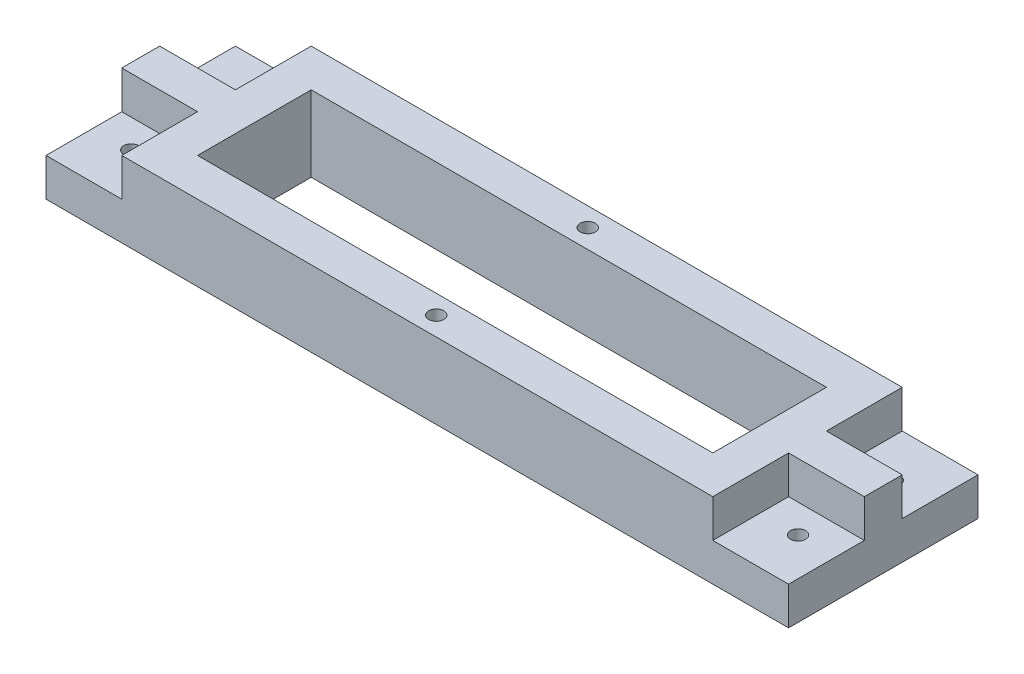
ISO-10303-21;
HEADER;
FILE_DESCRIPTION(('STEP AP214'),'2;1');
FILE_NAME('part.step','',(''),(''),'','','');
FILE_SCHEMA(('AUTOMOTIVE_DESIGN { 1 0 10303 214 1 1 1 1 }'));
ENDSEC;
DATA;
#1=APPLICATION_CONTEXT('core data for automotive mechanical design processes');
#2=APPLICATION_PROTOCOL_DEFINITION('international standard','automotive_design',2000,#1);
#3=PRODUCT_CONTEXT('',#1,'mechanical');
#4=PRODUCT('Part','Part','',(#3));
#5=PRODUCT_RELATED_PRODUCT_CATEGORY('part','',(#4));
#6=PRODUCT_DEFINITION_FORMATION('','',#4);
#7=PRODUCT_DEFINITION_CONTEXT('part definition',#1,'design');
#8=PRODUCT_DEFINITION('design','',#6,#7);
#9=PRODUCT_DEFINITION_SHAPE('','',#8);
#10=(LENGTH_UNIT() NAMED_UNIT(*) SI_UNIT(.MILLI.,.METRE.));
#11=(NAMED_UNIT(*) PLANE_ANGLE_UNIT() SI_UNIT($,.RADIAN.));
#12=(NAMED_UNIT(*) SI_UNIT($,.STERADIAN.) SOLID_ANGLE_UNIT());
#13=UNCERTAINTY_MEASURE_WITH_UNIT(LENGTH_MEASURE(1.E-05),#10,'distance_accuracy_value','');
#14=(GEOMETRIC_REPRESENTATION_CONTEXT(3) GLOBAL_UNCERTAINTY_ASSIGNED_CONTEXT((#13)) GLOBAL_UNIT_ASSIGNED_CONTEXT((#10,
#11,#12)) REPRESENTATION_CONTEXT('',''));
#15=CARTESIAN_POINT('',(0.,0.,0.));
#16=DIRECTION('',(0.,0.,1.));
#17=DIRECTION('',(1.,0.,0.));
#18=AXIS2_PLACEMENT_3D('',#15,#16,#17);
#19=CARTESIAN_POINT('',(0.,15.,-10.));
#20=DIRECTION('',(0.,-1.,0.));
#21=DIRECTION('',(0.,0.,-1.));
#22=AXIS2_PLACEMENT_3D('',#19,#20,#21);
#23=CYLINDRICAL_SURFACE('',#22,1.);
#24=CARTESIAN_POINT('',(0.,10.,-10.));
#25=DIRECTION('',(0.,1.,0.));
#26=DIRECTION('',(0.,0.,1.));
#27=AXIS2_PLACEMENT_3D('',#24,#25,#26);
#28=CIRCLE('',#27,1.);
#29=CARTESIAN_POINT('',(0.,10.,-9.00000000000001));
#30=VERTEX_POINT('',#29);
#31=EDGE_CURVE('E243',#30,#30,#28,.T.);
#32=ORIENTED_EDGE('',*,*,#31,.T.);
#33=EDGE_LOOP('',(#32));
#34=FACE_BOUND('',#33,.T.);
#35=CARTESIAN_POINT('',(0.,1.5,-10.));
#36=DIRECTION('',(0.,-1.,0.));
#37=DIRECTION('',(0.,0.,-1.));
#38=AXIS2_PLACEMENT_3D('',#35,#36,#37);
#39=CIRCLE('',#38,1.);
#40=CARTESIAN_POINT('',(0.,1.5,-11.));
#41=VERTEX_POINT('',#40);
#42=EDGE_CURVE('E40',#41,#41,#39,.F.);
#43=ORIENTED_EDGE('',*,*,#42,.F.);
#44=EDGE_LOOP('',(#43));
#45=FACE_BOUND('',#44,.T.);
#46=ADVANCED_FACE('F36',(#34,#45),#23,.F.);
#47=CARTESIAN_POINT('',(0.,0.,0.));
#48=DIRECTION('',(0.,1.,0.));
#49=DIRECTION('',(0.,0.,1.));
#50=AXIS2_PLACEMENT_3D('',#47,#48,#49);
#51=PLANE('',#50);
#52=CARTESIAN_POINT('',(0.,0.,-10.));
#53=DIRECTION('',(0.,-1.,0.));
#54=DIRECTION('',(0.,0.,-1.));
#55=AXIS2_PLACEMENT_3D('',#52,#53,#54);
#56=CIRCLE('',#55,1.75);
#57=CARTESIAN_POINT('',(0.,0.,-11.75));
#58=VERTEX_POINT('',#57);
#59=EDGE_CURVE('E254',#58,#58,#56,.T.);
#60=ORIENTED_EDGE('',*,*,#59,.F.);
#61=EDGE_LOOP('',(#60));
#62=FACE_BOUND('',#61,.T.);
#63=CARTESIAN_POINT('',(0.,0.,10.));
#64=DIRECTION('',(0.,-1.,0.));
#65=DIRECTION('',(0.,0.,-1.));
#66=AXIS2_PLACEMENT_3D('',#63,#64,#65);
#67=CIRCLE('',#66,1.75);
#68=CARTESIAN_POINT('',(0.,0.,8.25));
#69=VERTEX_POINT('',#68);
#70=EDGE_CURVE('E241',#69,#69,#67,.T.);
#71=ORIENTED_EDGE('',*,*,#70,.F.);
#72=EDGE_LOOP('',(#71));
#73=FACE_BOUND('',#72,.T.);
#74=CARTESIAN_POINT('',(44.,0.,-6.25));
#75=DIRECTION('',(0.,-1.,0.));
#76=DIRECTION('',(0.,0.,-1.));
#77=AXIS2_PLACEMENT_3D('',#74,#75,#76);
#78=CIRCLE('',#77,1.75);
#79=CARTESIAN_POINT('',(44.,0.,-8.00000000000001));
#80=VERTEX_POINT('',#79);
#81=EDGE_CURVE('E238',#80,#80,#78,.T.);
#82=ORIENTED_EDGE('',*,*,#81,.F.);
#83=EDGE_LOOP('',(#82));
#84=FACE_BOUND('',#83,.T.);
#85=CARTESIAN_POINT('',(-44.,0.,6.25));
#86=DIRECTION('',(0.,-1.,0.));
#87=DIRECTION('',(0.,0.,-1.));
#88=AXIS2_PLACEMENT_3D('',#85,#86,#87);
#89=CIRCLE('',#88,1.75);
#90=CARTESIAN_POINT('',(-44.,0.,4.5));
#91=VERTEX_POINT('',#90);
#92=EDGE_CURVE('E286',#91,#91,#89,.T.);
#93=ORIENTED_EDGE('',*,*,#92,.F.);
#94=EDGE_LOOP('',(#93));
#95=FACE_BOUND('',#94,.T.);
#96=DIRECTION('',(-1.,0.,0.));
#97=VECTOR('',#96,1.);
#98=CARTESIAN_POINT('',(-39.,0.,-12.5));
#99=LINE('',#98,#97);
#100=CARTESIAN_POINT('',(49.,0.,-12.5));
#101=VERTEX_POINT('',#100);
#102=CARTESIAN_POINT('',(-49.,0.,-12.5));
#103=VERTEX_POINT('',#102);
#104=EDGE_CURVE('E214',#101,#103,#99,.T.);
#105=ORIENTED_EDGE('',*,*,#104,.F.);
#106=DIRECTION('',(0.,0.,-1.));
#107=VECTOR('',#106,1.);
#108=CARTESIAN_POINT('',(49.,0.,12.5));
#109=LINE('',#108,#107);
#110=CARTESIAN_POINT('',(49.,0.,12.5));
#111=VERTEX_POINT('',#110);
#112=EDGE_CURVE('E331',#111,#101,#109,.T.);
#113=ORIENTED_EDGE('',*,*,#112,.F.);
#114=DIRECTION('',(1.,0.,0.));
#115=VECTOR('',#114,1.);
#116=CARTESIAN_POINT('',(-39.,0.,12.5));
#117=LINE('',#116,#115);
#118=CARTESIAN_POINT('',(-49.,0.,12.5));
#119=VERTEX_POINT('',#118);
#120=EDGE_CURVE('E216',#119,#111,#117,.T.);
#121=ORIENTED_EDGE('',*,*,#120,.F.);
#122=DIRECTION('',(0.,0.,1.));
#123=VECTOR('',#122,1.);
#124=CARTESIAN_POINT('',(-49.,0.,12.5));
#125=LINE('',#124,#123);
#126=EDGE_CURVE('E350',#103,#119,#125,.T.);
#127=ORIENTED_EDGE('',*,*,#126,.F.);
#128=EDGE_LOOP('',(#105,#113,#121,#127));
#129=FACE_BOUND('',#128,.T.);
#130=DIRECTION('',(0.,0.,-1.));
#131=VECTOR('',#130,1.);
#132=CARTESIAN_POINT('',(-34.,0.,0.));
#133=LINE('',#132,#131);
#134=CARTESIAN_POINT('',(-34.,0.,7.50000000000001));
#135=VERTEX_POINT('',#134);
#136=CARTESIAN_POINT('',(-34.,0.,-7.50000000000001));
#137=VERTEX_POINT('',#136);
#138=EDGE_CURVE('E371',#135,#137,#133,.T.);
#139=ORIENTED_EDGE('',*,*,#138,.F.);
#140=DIRECTION('',(-1.,0.,0.));
#141=VECTOR('',#140,1.);
#142=CARTESIAN_POINT('',(0.,0.,7.50000000000001));
#143=LINE('',#142,#141);
#144=CARTESIAN_POINT('',(34.,0.,7.50000000000001));
#145=VERTEX_POINT('',#144);
#146=EDGE_CURVE('E373',#145,#135,#143,.T.);
#147=ORIENTED_EDGE('',*,*,#146,.F.);
#148=DIRECTION('',(0.,0.,-1.));
#149=VECTOR('',#148,1.);
#150=CARTESIAN_POINT('',(34.,0.,0.));
#151=LINE('',#150,#149);
#152=CARTESIAN_POINT('',(34.,0.,-7.50000000000001));
#153=VERTEX_POINT('',#152);
#154=EDGE_CURVE('E376',#145,#153,#151,.T.);
#155=ORIENTED_EDGE('',*,*,#154,.T.);
#156=DIRECTION('',(-1.,0.,0.));
#157=VECTOR('',#156,1.);
#158=CARTESIAN_POINT('',(0.,0.,-7.50000000000001));
#159=LINE('',#158,#157);
#160=EDGE_CURVE('E379',#153,#137,#159,.T.);
#161=ORIENTED_EDGE('',*,*,#160,.T.);
#162=EDGE_LOOP('',(#139,#147,#155,#161));
#163=FACE_BOUND('',#162,.T.);
#164=CARTESIAN_POINT('',(44.,0.,6.25));
#165=DIRECTION('',(0.,-1.,0.));
#166=DIRECTION('',(0.,0.,-1.));
#167=AXIS2_PLACEMENT_3D('',#164,#165,#166);
#168=CIRCLE('',#167,1.75);
#169=CARTESIAN_POINT('',(44.,0.,4.5));
#170=VERTEX_POINT('',#169);
#171=EDGE_CURVE('E280',#170,#170,#168,.F.);
#172=ORIENTED_EDGE('',*,*,#171,.T.);
#173=EDGE_LOOP('',(#172));
#174=FACE_BOUND('',#173,.T.);
#175=CARTESIAN_POINT('',(-44.,0.,-6.25));
#176=DIRECTION('',(0.,-1.,0.));
#177=DIRECTION('',(0.,0.,-1.));
#178=AXIS2_PLACEMENT_3D('',#175,#176,#177);
#179=CIRCLE('',#178,1.75);
#180=CARTESIAN_POINT('',(-44.,0.,-8.00000000000001));
#181=VERTEX_POINT('',#180);
#182=EDGE_CURVE('E287',#181,#181,#179,.F.);
#183=ORIENTED_EDGE('',*,*,#182,.T.);
#184=EDGE_LOOP('',(#183));
#185=FACE_BOUND('',#184,.T.);
#186=ADVANCED_FACE('F425',(#62,#73,#84,#95,#129,#163,#174,#185),#51,.F.);
#187=CARTESIAN_POINT('',(-39.,10.,-12.5));
#188=DIRECTION('',(1.,0.,0.));
#189=DIRECTION('',(0.,0.,-1.));
#190=AXIS2_PLACEMENT_3D('',#187,#188,#189);
#191=PLANE('',#190);
#192=DIRECTION('',(0.,-1.,0.));
#193=VECTOR('',#192,1.);
#194=CARTESIAN_POINT('',(-39.,10.,2.5));
#195=LINE('',#194,#193);
#196=CARTESIAN_POINT('',(-39.,10.,2.5));
#197=VERTEX_POINT('',#196);
#198=CARTESIAN_POINT('',(-39.,5.,2.5));
#199=VERTEX_POINT('',#198);
#200=EDGE_CURVE('E190',#197,#199,#195,.T.);
#201=ORIENTED_EDGE('',*,*,#200,.T.);
#202=DIRECTION('',(0.,0.,-1.));
#203=VECTOR('',#202,1.);
#204=CARTESIAN_POINT('',(-39.,5.,-12.5));
#205=LINE('',#204,#203);
#206=CARTESIAN_POINT('',(-39.,5.,12.5));
#207=VERTEX_POINT('',#206);
#208=EDGE_CURVE('E354',#207,#199,#205,.T.);
#209=ORIENTED_EDGE('',*,*,#208,.F.);
#210=DIRECTION('',(0.,-1.,0.));
#211=VECTOR('',#210,1.);
#212=CARTESIAN_POINT('',(-39.,10.,12.5));
#213=LINE('',#212,#211);
#214=CARTESIAN_POINT('',(-39.,10.,12.5));
#215=VERTEX_POINT('',#214);
#216=EDGE_CURVE('E201',#215,#207,#213,.T.);
#217=ORIENTED_EDGE('',*,*,#216,.F.);
#218=DIRECTION('',(0.,0.,1.));
#219=VECTOR('',#218,1.);
#220=CARTESIAN_POINT('',(-39.,10.,-12.5));
#221=LINE('',#220,#219);
#222=EDGE_CURVE('E180',#197,#215,#221,.T.);
#223=ORIENTED_EDGE('',*,*,#222,.F.);
#224=EDGE_LOOP('',(#201,#209,#217,#223));
#225=FACE_BOUND('',#224,.T.);
#226=ADVANCED_FACE('F199',(#225),#191,.F.);
#227=CARTESIAN_POINT('',(-49.,5.,-12.5));
#228=DIRECTION('',(0.,-1.,0.));
#229=DIRECTION('',(0.,0.,-1.));
#230=AXIS2_PLACEMENT_3D('',#227,#228,#229);
#231=PLANE('',#230);
#232=CARTESIAN_POINT('',(-44.,5.,6.25));
#233=DIRECTION('',(0.,-1.,0.));
#234=DIRECTION('',(0.,0.,-1.));
#235=AXIS2_PLACEMENT_3D('',#232,#233,#234);
#236=CIRCLE('',#235,0.999999999999998);
#237=CARTESIAN_POINT('',(-44.,5.,5.25));
#238=VERTEX_POINT('',#237);
#239=EDGE_CURVE('E235',#238,#238,#236,.T.);
#240=ORIENTED_EDGE('',*,*,#239,.T.);
#241=EDGE_LOOP('',(#240));
#242=FACE_BOUND('',#241,.T.);
#243=DIRECTION('',(1.,0.,0.));
#244=VECTOR('',#243,1.);
#245=CARTESIAN_POINT('',(0.,5.,2.49999999999999));
#246=LINE('',#245,#244);
#247=CARTESIAN_POINT('',(-49.,5.,2.5));
#248=VERTEX_POINT('',#247);
#249=EDGE_CURVE('E193',#248,#199,#246,.T.);
#250=ORIENTED_EDGE('',*,*,#249,.F.);
#251=DIRECTION('',(0.,0.,-1.));
#252=VECTOR('',#251,1.);
#253=CARTESIAN_POINT('',(-49.,5.,-12.5));
#254=LINE('',#253,#252);
#255=CARTESIAN_POINT('',(-49.,5.,12.5));
#256=VERTEX_POINT('',#255);
#257=EDGE_CURVE('E357',#256,#248,#254,.T.);
#258=ORIENTED_EDGE('',*,*,#257,.F.);
#259=DIRECTION('',(1.,0.,0.));
#260=VECTOR('',#259,1.);
#261=CARTESIAN_POINT('',(-49.,5.,12.5));
#262=LINE('',#261,#260);
#263=EDGE_CURVE('E367',#256,#207,#262,.T.);
#264=ORIENTED_EDGE('',*,*,#263,.T.);
#265=ORIENTED_EDGE('',*,*,#208,.T.);
#266=EDGE_LOOP('',(#250,#258,#264,#265));
#267=FACE_BOUND('',#266,.T.);
#268=ADVANCED_FACE('F443',(#242,#267),#231,.F.);
#269=CARTESIAN_POINT('',(39.,10.,-12.5));
#270=DIRECTION('',(-1.,0.,0.));
#271=DIRECTION('',(0.,0.,1.));
#272=AXIS2_PLACEMENT_3D('',#269,#270,#271);
#273=PLANE('',#272);
#274=DIRECTION('',(0.,-1.,0.));
#275=VECTOR('',#274,1.);
#276=CARTESIAN_POINT('',(39.,10.,-2.50000000000003));
#277=LINE('',#276,#275);
#278=CARTESIAN_POINT('',(39.,10.,-2.50000000000003));
#279=VERTEX_POINT('',#278);
#280=CARTESIAN_POINT('',(39.,5.,-2.50000000000003));
#281=VERTEX_POINT('',#280);
#282=EDGE_CURVE('E322',#279,#281,#277,.T.);
#283=ORIENTED_EDGE('',*,*,#282,.T.);
#284=DIRECTION('',(0.,0.,1.));
#285=VECTOR('',#284,1.);
#286=CARTESIAN_POINT('',(39.,5.,12.5));
#287=LINE('',#286,#285);
#288=CARTESIAN_POINT('',(39.,5.,-12.5));
#289=VERTEX_POINT('',#288);
#290=EDGE_CURVE('E332',#289,#281,#287,.T.);
#291=ORIENTED_EDGE('',*,*,#290,.F.);
#292=DIRECTION('',(0.,-1.,0.));
#293=VECTOR('',#292,1.);
#294=CARTESIAN_POINT('',(39.,10.,-12.5));
#295=LINE('',#294,#293);
#296=CARTESIAN_POINT('',(39.,10.,-12.5));
#297=VERTEX_POINT('',#296);
#298=EDGE_CURVE('E11',#297,#289,#295,.T.);
#299=ORIENTED_EDGE('',*,*,#298,.F.);
#300=DIRECTION('',(0.,0.,-1.));
#301=VECTOR('',#300,1.);
#302=CARTESIAN_POINT('',(39.,10.,-12.5));
#303=LINE('',#302,#301);
#304=EDGE_CURVE('E219',#279,#297,#303,.T.);
#305=ORIENTED_EDGE('',*,*,#304,.F.);
#306=EDGE_LOOP('',(#283,#291,#299,#305));
#307=FACE_BOUND('',#306,.T.);
#308=ADVANCED_FACE('F413',(#307),#273,.F.);
#309=CARTESIAN_POINT('',(49.,5.,12.5));
#310=DIRECTION('',(0.,-1.,0.));
#311=DIRECTION('',(0.,0.,-1.));
#312=AXIS2_PLACEMENT_3D('',#309,#310,#311);
#313=PLANE('',#312);
#314=CARTESIAN_POINT('',(44.,5.,-6.24999999999999));
#315=DIRECTION('',(0.,-1.,0.));
#316=DIRECTION('',(0.,0.,-1.));
#317=AXIS2_PLACEMENT_3D('',#314,#315,#316);
#318=CIRCLE('',#317,0.999999999999998);
#319=CARTESIAN_POINT('',(44.,5.,-7.24999999999999));
#320=VERTEX_POINT('',#319);
#321=EDGE_CURVE('E232',#320,#320,#318,.T.);
#322=ORIENTED_EDGE('',*,*,#321,.T.);
#323=EDGE_LOOP('',(#322));
#324=FACE_BOUND('',#323,.T.);
#325=DIRECTION('',(-1.,0.,0.));
#326=VECTOR('',#325,1.);
#327=CARTESIAN_POINT('',(0.,5.,-2.49999999999994));
#328=LINE('',#327,#326);
#329=CARTESIAN_POINT('',(49.,5.,-2.50000000000005));
#330=VERTEX_POINT('',#329);
#331=EDGE_CURVE('E196',#330,#281,#328,.T.);
#332=ORIENTED_EDGE('',*,*,#331,.F.);
#333=DIRECTION('',(0.,0.,1.));
#334=VECTOR('',#333,1.);
#335=CARTESIAN_POINT('',(49.,5.,12.5));
#336=LINE('',#335,#334);
#337=CARTESIAN_POINT('',(49.,5.,-12.5));
#338=VERTEX_POINT('',#337);
#339=EDGE_CURVE('E338',#338,#330,#336,.T.);
#340=ORIENTED_EDGE('',*,*,#339,.F.);
#341=DIRECTION('',(-1.,0.,0.));
#342=VECTOR('',#341,1.);
#343=CARTESIAN_POINT('',(49.,5.,-12.5));
#344=LINE('',#343,#342);
#345=EDGE_CURVE('E346',#338,#289,#344,.T.);
#346=ORIENTED_EDGE('',*,*,#345,.T.);
#347=ORIENTED_EDGE('',*,*,#290,.T.);
#348=EDGE_LOOP('',(#332,#340,#346,#347));
#349=FACE_BOUND('',#348,.T.);
#350=ADVANCED_FACE('F416',(#324,#349),#313,.F.);
#351=CARTESIAN_POINT('',(39.,5.,2.5));
#352=VERTEX_POINT('',#351);
#353=CARTESIAN_POINT('',(39.,5.,12.5));
#354=VERTEX_POINT('',#353);
#355=EDGE_CURVE('E327',#352,#354,#287,.T.);
#356=ORIENTED_EDGE('',*,*,#355,.F.);
#357=DIRECTION('',(0.,-1.,0.));
#358=VECTOR('',#357,1.);
#359=CARTESIAN_POINT('',(39.,10.,2.5));
#360=LINE('',#359,#358);
#361=CARTESIAN_POINT('',(39.,10.,2.5));
#362=VERTEX_POINT('',#361);
#363=EDGE_CURVE('E320',#362,#352,#360,.T.);
#364=ORIENTED_EDGE('',*,*,#363,.F.);
#365=CARTESIAN_POINT('',(39.,10.,12.5));
#366=VERTEX_POINT('',#365);
#367=EDGE_CURVE('E208',#366,#362,#303,.T.);
#368=ORIENTED_EDGE('',*,*,#367,.F.);
#369=DIRECTION('',(0.,-1.,0.));
#370=VECTOR('',#369,1.);
#371=CARTESIAN_POINT('',(39.,10.,12.5));
#372=LINE('',#371,#370);
#373=EDGE_CURVE('E213',#366,#354,#372,.T.);
#374=ORIENTED_EDGE('',*,*,#373,.T.);
#375=EDGE_LOOP('',(#356,#364,#368,#374));
#376=FACE_BOUND('',#375,.T.);
#377=ADVANCED_FACE('F38',(#376),#273,.F.);
#378=CARTESIAN_POINT('',(-39.,5.,-2.50000000000003));
#379=VERTEX_POINT('',#378);
#380=CARTESIAN_POINT('',(-39.,5.,-12.5));
#381=VERTEX_POINT('',#380);
#382=EDGE_CURVE('E349',#379,#381,#205,.T.);
#383=ORIENTED_EDGE('',*,*,#382,.F.);
#384=DIRECTION('',(0.,-1.,0.));
#385=VECTOR('',#384,1.);
#386=CARTESIAN_POINT('',(-39.,10.,-2.50000000000003));
#387=LINE('',#386,#385);
#388=CARTESIAN_POINT('',(-39.,10.,-2.50000000000003));
#389=VERTEX_POINT('',#388);
#390=EDGE_CURVE('E197',#389,#379,#387,.T.);
#391=ORIENTED_EDGE('',*,*,#390,.F.);
#392=CARTESIAN_POINT('',(-39.,10.,-12.5));
#393=VERTEX_POINT('',#392);
#394=EDGE_CURVE('E203',#393,#389,#221,.T.);
#395=ORIENTED_EDGE('',*,*,#394,.F.);
#396=DIRECTION('',(0.,-1.,0.));
#397=VECTOR('',#396,1.);
#398=CARTESIAN_POINT('',(-39.,10.,-12.5));
#399=LINE('',#398,#397);
#400=EDGE_CURVE('E45',#393,#381,#399,.T.);
#401=ORIENTED_EDGE('',*,*,#400,.T.);
#402=EDGE_LOOP('',(#383,#391,#395,#401));
#403=FACE_BOUND('',#402,.T.);
#404=ADVANCED_FACE('F439',(#403),#191,.F.);
#405=CARTESIAN_POINT('',(0.,10.,0.));
#406=DIRECTION('',(0.,1.,0.));
#407=DIRECTION('',(0.,0.,1.));
#408=AXIS2_PLACEMENT_3D('',#405,#406,#407);
#409=PLANE('',#408);
#410=ORIENTED_EDGE('',*,*,#31,.F.);
#411=EDGE_LOOP('',(#410));
#412=FACE_BOUND('',#411,.T.);
#413=CARTESIAN_POINT('',(0.,10.,10.));
#414=DIRECTION('',(0.,1.,0.));
#415=DIRECTION('',(0.,0.,1.));
#416=AXIS2_PLACEMENT_3D('',#413,#414,#415);
#417=CIRCLE('',#416,1.);
#418=CARTESIAN_POINT('',(0.,10.,11.));
#419=VERTEX_POINT('',#418);
#420=EDGE_CURVE('E239',#419,#419,#417,.T.);
#421=ORIENTED_EDGE('',*,*,#420,.F.);
#422=EDGE_LOOP('',(#421));
#423=FACE_BOUND('',#422,.T.);
#424=ORIENTED_EDGE('',*,*,#367,.T.);
#425=DIRECTION('',(-1.,0.,0.));
#426=VECTOR('',#425,1.);
#427=CARTESIAN_POINT('',(0.,10.,2.49999999999999));
#428=LINE('',#427,#426);
#429=CARTESIAN_POINT('',(49.,10.,2.5));
#430=VERTEX_POINT('',#429);
#431=EDGE_CURVE('E314',#430,#362,#428,.T.);
#432=ORIENTED_EDGE('',*,*,#431,.F.);
#433=DIRECTION('',(0.,0.,1.));
#434=VECTOR('',#433,1.);
#435=CARTESIAN_POINT('',(49.,10.,0.));
#436=LINE('',#435,#434);
#437=CARTESIAN_POINT('',(49.,10.,-2.50000000000005));
#438=VERTEX_POINT('',#437);
#439=EDGE_CURVE('E309',#438,#430,#436,.T.);
#440=ORIENTED_EDGE('',*,*,#439,.F.);
#441=DIRECTION('',(-1.,0.,0.));
#442=VECTOR('',#441,1.);
#443=CARTESIAN_POINT('',(0.,10.,-2.49999999999994));
#444=LINE('',#443,#442);
#445=EDGE_CURVE('E312',#438,#279,#444,.T.);
#446=ORIENTED_EDGE('',*,*,#445,.T.);
#447=ORIENTED_EDGE('',*,*,#304,.T.);
#448=DIRECTION('',(-1.,0.,0.));
#449=VECTOR('',#448,1.);
#450=CARTESIAN_POINT('',(-39.,10.,-12.5));
#451=LINE('',#450,#449);
#452=EDGE_CURVE('E204',#297,#393,#451,.T.);
#453=ORIENTED_EDGE('',*,*,#452,.T.);
#454=ORIENTED_EDGE('',*,*,#394,.T.);
#455=DIRECTION('',(1.,0.,0.));
#456=VECTOR('',#455,1.);
#457=CARTESIAN_POINT('',(0.,10.,-2.49999999999994));
#458=LINE('',#457,#456);
#459=CARTESIAN_POINT('',(-49.,10.,-2.50000000000005));
#460=VERTEX_POINT('',#459);
#461=EDGE_CURVE('E187',#460,#389,#458,.T.);
#462=ORIENTED_EDGE('',*,*,#461,.F.);
#463=DIRECTION('',(0.,0.,1.));
#464=VECTOR('',#463,1.);
#465=CARTESIAN_POINT('',(-49.,10.,0.));
#466=LINE('',#465,#464);
#467=CARTESIAN_POINT('',(-49.,10.,2.5));
#468=VERTEX_POINT('',#467);
#469=EDGE_CURVE('E184',#460,#468,#466,.T.);
#470=ORIENTED_EDGE('',*,*,#469,.T.);
#471=DIRECTION('',(1.,0.,0.));
#472=VECTOR('',#471,1.);
#473=CARTESIAN_POINT('',(0.,10.,2.49999999999999));
#474=LINE('',#473,#472);
#475=EDGE_CURVE('E174',#468,#197,#474,.T.);
#476=ORIENTED_EDGE('',*,*,#475,.T.);
#477=ORIENTED_EDGE('',*,*,#222,.T.);
#478=DIRECTION('',(1.,0.,0.));
#479=VECTOR('',#478,1.);
#480=CARTESIAN_POINT('',(-39.,10.,12.5));
#481=LINE('',#480,#479);
#482=EDGE_CURVE('E207',#215,#366,#481,.T.);
#483=ORIENTED_EDGE('',*,*,#482,.T.);
#484=EDGE_LOOP('',(#424,#432,#440,#446,#447,#453,#454,#462,#470,#476,#477,#483));
#485=FACE_BOUND('',#484,.T.);
#486=DIRECTION('',(-1.,0.,0.));
#487=VECTOR('',#486,1.);
#488=CARTESIAN_POINT('',(0.,10.,7.50000000000001));
#489=LINE('',#488,#487);
#490=CARTESIAN_POINT('',(34.,10.,7.50000000000001));
#491=VERTEX_POINT('',#490);
#492=CARTESIAN_POINT('',(-34.,10.,7.50000000000001));
#493=VERTEX_POINT('',#492);
#494=EDGE_CURVE('E385',#491,#493,#489,.T.);
#495=ORIENTED_EDGE('',*,*,#494,.T.);
#496=DIRECTION('',(0.,0.,-1.));
#497=VECTOR('',#496,1.);
#498=CARTESIAN_POINT('',(-34.,10.,0.));
#499=LINE('',#498,#497);
#500=CARTESIAN_POINT('',(-34.,10.,-7.50000000000001));
#501=VERTEX_POINT('',#500);
#502=EDGE_CURVE('E370',#493,#501,#499,.T.);
#503=ORIENTED_EDGE('',*,*,#502,.T.);
#504=DIRECTION('',(-1.,0.,0.));
#505=VECTOR('',#504,1.);
#506=CARTESIAN_POINT('',(0.,10.,-7.50000000000001));
#507=LINE('',#506,#505);
#508=CARTESIAN_POINT('',(34.,10.,-7.50000000000001));
#509=VERTEX_POINT('',#508);
#510=EDGE_CURVE('E374',#509,#501,#507,.T.);
#511=ORIENTED_EDGE('',*,*,#510,.F.);
#512=DIRECTION('',(0.,0.,-1.));
#513=VECTOR('',#512,1.);
#514=CARTESIAN_POINT('',(34.,10.,0.));
#515=LINE('',#514,#513);
#516=EDGE_CURVE('E388',#491,#509,#515,.T.);
#517=ORIENTED_EDGE('',*,*,#516,.F.);
#518=EDGE_LOOP('',(#495,#503,#511,#517));
#519=FACE_BOUND('',#518,.T.);
#520=ADVANCED_FACE('F177',(#412,#423,#485,#519),#409,.T.);
#521=CARTESIAN_POINT('',(-39.,10.,-12.5));
#522=DIRECTION('',(0.,0.,1.));
#523=DIRECTION('',(1.,0.,0.));
#524=AXIS2_PLACEMENT_3D('',#521,#522,#523);
#525=PLANE('',#524);
#526=ORIENTED_EDGE('',*,*,#104,.T.);
#527=DIRECTION('',(0.,-1.,0.));
#528=VECTOR('',#527,1.);
#529=CARTESIAN_POINT('',(-49.,0.,-12.5));
#530=LINE('',#529,#528);
#531=CARTESIAN_POINT('',(-49.,5.,-12.5));
#532=VERTEX_POINT('',#531);
#533=EDGE_CURVE('E360',#532,#103,#530,.T.);
#534=ORIENTED_EDGE('',*,*,#533,.F.);
#535=DIRECTION('',(1.,0.,0.));
#536=VECTOR('',#535,1.);
#537=CARTESIAN_POINT('',(-49.,5.,-12.5));
#538=LINE('',#537,#536);
#539=EDGE_CURVE('E363',#532,#381,#538,.T.);
#540=ORIENTED_EDGE('',*,*,#539,.T.);
#541=ORIENTED_EDGE('',*,*,#400,.F.);
#542=ORIENTED_EDGE('',*,*,#452,.F.);
#543=ORIENTED_EDGE('',*,*,#298,.T.);
#544=ORIENTED_EDGE('',*,*,#345,.F.);
#545=DIRECTION('',(0.,1.,0.));
#546=VECTOR('',#545,1.);
#547=CARTESIAN_POINT('',(49.,5.,-12.5));
#548=LINE('',#547,#546);
#549=EDGE_CURVE('E335',#101,#338,#548,.T.);
#550=ORIENTED_EDGE('',*,*,#549,.F.);
#551=EDGE_LOOP('',(#526,#534,#540,#541,#542,#543,#544,#550));
#552=FACE_BOUND('',#551,.T.);
#553=ADVANCED_FACE('F410',(#552),#525,.F.);
#554=CARTESIAN_POINT('',(-39.,10.,12.5));
#555=DIRECTION('',(0.,0.,-1.));
#556=DIRECTION('',(-1.,0.,0.));
#557=AXIS2_PLACEMENT_3D('',#554,#555,#556);
#558=PLANE('',#557);
#559=ORIENTED_EDGE('',*,*,#120,.T.);
#560=DIRECTION('',(0.,-1.,0.));
#561=VECTOR('',#560,1.);
#562=CARTESIAN_POINT('',(49.,5.,12.5));
#563=LINE('',#562,#561);
#564=CARTESIAN_POINT('',(49.,5.,12.5));
#565=VERTEX_POINT('',#564);
#566=EDGE_CURVE('E328',#565,#111,#563,.T.);
#567=ORIENTED_EDGE('',*,*,#566,.F.);
#568=DIRECTION('',(-1.,0.,0.));
#569=VECTOR('',#568,1.);
#570=CARTESIAN_POINT('',(49.,5.,12.5));
#571=LINE('',#570,#569);
#572=EDGE_CURVE('E341',#565,#354,#571,.T.);
#573=ORIENTED_EDGE('',*,*,#572,.T.);
#574=ORIENTED_EDGE('',*,*,#373,.F.);
#575=ORIENTED_EDGE('',*,*,#482,.F.);
#576=ORIENTED_EDGE('',*,*,#216,.T.);
#577=ORIENTED_EDGE('',*,*,#263,.F.);
#578=DIRECTION('',(0.,1.,0.));
#579=VECTOR('',#578,1.);
#580=CARTESIAN_POINT('',(-49.,5.,12.5));
#581=LINE('',#580,#579);
#582=EDGE_CURVE('E353',#119,#256,#581,.T.);
#583=ORIENTED_EDGE('',*,*,#582,.F.);
#584=EDGE_LOOP('',(#559,#567,#573,#574,#575,#576,#577,#583));
#585=FACE_BOUND('',#584,.T.);
#586=ADVANCED_FACE('F445',(#585),#558,.F.);
#587=CARTESIAN_POINT('',(-34.,0.,0.));
#588=DIRECTION('',(1.,0.,0.));
#589=DIRECTION('',(0.,0.,-1.));
#590=AXIS2_PLACEMENT_3D('',#587,#588,#589);
#591=PLANE('',#590);
#592=ORIENTED_EDGE('',*,*,#502,.F.);
#593=DIRECTION('',(0.,1.,0.));
#594=VECTOR('',#593,1.);
#595=CARTESIAN_POINT('',(-34.,0.,7.50000000000001));
#596=LINE('',#595,#594);
#597=EDGE_CURVE('E382',#135,#493,#596,.T.);
#598=ORIENTED_EDGE('',*,*,#597,.F.);
#599=ORIENTED_EDGE('',*,*,#138,.T.);
#600=DIRECTION('',(0.,1.,0.));
#601=VECTOR('',#600,1.);
#602=CARTESIAN_POINT('',(-34.,0.,-7.50000000000001));
#603=LINE('',#602,#601);
#604=EDGE_CURVE('E217',#137,#501,#603,.T.);
#605=ORIENTED_EDGE('',*,*,#604,.T.);
#606=EDGE_LOOP('',(#592,#598,#599,#605));
#607=FACE_BOUND('',#606,.T.);
#608=ADVANCED_FACE('F770',(#607),#591,.T.);
#609=CARTESIAN_POINT('',(0.,0.,-7.50000000000001));
#610=DIRECTION('',(0.,0.,-1.));
#611=DIRECTION('',(-1.,0.,0.));
#612=AXIS2_PLACEMENT_3D('',#609,#610,#611);
#613=PLANE('',#612);
#614=ORIENTED_EDGE('',*,*,#510,.T.);
#615=ORIENTED_EDGE('',*,*,#604,.F.);
#616=ORIENTED_EDGE('',*,*,#160,.F.);
#617=DIRECTION('',(0.,1.,0.));
#618=VECTOR('',#617,1.);
#619=CARTESIAN_POINT('',(34.,0.,-7.50000000000001));
#620=LINE('',#619,#618);
#621=EDGE_CURVE('E394',#153,#509,#620,.T.);
#622=ORIENTED_EDGE('',*,*,#621,.T.);
#623=EDGE_LOOP('',(#614,#615,#616,#622));
#624=FACE_BOUND('',#623,.T.);
#625=ADVANCED_FACE('F762',(#624),#613,.F.);
#626=CARTESIAN_POINT('',(34.,0.,0.));
#627=DIRECTION('',(1.,0.,0.));
#628=DIRECTION('',(0.,0.,-1.));
#629=AXIS2_PLACEMENT_3D('',#626,#627,#628);
#630=PLANE('',#629);
#631=ORIENTED_EDGE('',*,*,#516,.T.);
#632=ORIENTED_EDGE('',*,*,#621,.F.);
#633=ORIENTED_EDGE('',*,*,#154,.F.);
#634=DIRECTION('',(0.,1.,0.));
#635=VECTOR('',#634,1.);
#636=CARTESIAN_POINT('',(34.,0.,7.50000000000001));
#637=LINE('',#636,#635);
#638=EDGE_CURVE('E396',#145,#491,#637,.T.);
#639=ORIENTED_EDGE('',*,*,#638,.T.);
#640=EDGE_LOOP('',(#631,#632,#633,#639));
#641=FACE_BOUND('',#640,.T.);
#642=ADVANCED_FACE('F754',(#641),#630,.F.);
#643=CARTESIAN_POINT('',(0.,0.,7.50000000000001));
#644=DIRECTION('',(0.,0.,-1.));
#645=DIRECTION('',(-1.,0.,0.));
#646=AXIS2_PLACEMENT_3D('',#643,#644,#645);
#647=PLANE('',#646);
#648=ORIENTED_EDGE('',*,*,#494,.F.);
#649=ORIENTED_EDGE('',*,*,#638,.F.);
#650=ORIENTED_EDGE('',*,*,#146,.T.);
#651=ORIENTED_EDGE('',*,*,#597,.T.);
#652=EDGE_LOOP('',(#648,#649,#650,#651));
#653=FACE_BOUND('',#652,.T.);
#654=ADVANCED_FACE('F744',(#653),#647,.T.);
#655=CARTESIAN_POINT('',(-44.,5.,-6.24999999999999));
#656=DIRECTION('',(0.,-1.,0.));
#657=DIRECTION('',(0.,0.,-1.));
#658=AXIS2_PLACEMENT_3D('',#655,#656,#657);
#659=CIRCLE('',#658,0.999999999999998);
#660=CARTESIAN_POINT('',(-44.,5.,-7.24999999999999));
#661=VERTEX_POINT('',#660);
#662=EDGE_CURVE('E228',#661,#661,#659,.F.);
#663=ORIENTED_EDGE('',*,*,#662,.F.);
#664=EDGE_LOOP('',(#663));
#665=FACE_BOUND('',#664,.T.);
#666=CARTESIAN_POINT('',(-49.,5.,-2.50000000000005));
#667=VERTEX_POINT('',#666);
#668=EDGE_CURVE('E356',#667,#532,#254,.T.);
#669=ORIENTED_EDGE('',*,*,#668,.F.);
#670=DIRECTION('',(1.,0.,0.));
#671=VECTOR('',#670,1.);
#672=CARTESIAN_POINT('',(0.,5.,-2.49999999999994));
#673=LINE('',#672,#671);
#674=EDGE_CURVE('E53',#667,#379,#673,.T.);
#675=ORIENTED_EDGE('',*,*,#674,.T.);
#676=ORIENTED_EDGE('',*,*,#382,.T.);
#677=ORIENTED_EDGE('',*,*,#539,.F.);
#678=EDGE_LOOP('',(#669,#675,#676,#677));
#679=FACE_BOUND('',#678,.T.);
#680=ADVANCED_FACE('F435',(#665,#679),#231,.F.);
#681=CARTESIAN_POINT('',(-49.,0.,0.));
#682=DIRECTION('',(1.,0.,0.));
#683=DIRECTION('',(0.,0.,-1.));
#684=AXIS2_PLACEMENT_3D('',#681,#682,#683);
#685=PLANE('',#684);
#686=ORIENTED_EDGE('',*,*,#126,.T.);
#687=ORIENTED_EDGE('',*,*,#582,.T.);
#688=ORIENTED_EDGE('',*,*,#257,.T.);
#689=DIRECTION('',(0.,-1.,0.));
#690=VECTOR('',#689,1.);
#691=CARTESIAN_POINT('',(-49.,10.,2.5));
#692=LINE('',#691,#690);
#693=EDGE_CURVE('E302',#468,#248,#692,.T.);
#694=ORIENTED_EDGE('',*,*,#693,.F.);
#695=ORIENTED_EDGE('',*,*,#469,.F.);
#696=DIRECTION('',(0.,-1.,0.));
#697=VECTOR('',#696,1.);
#698=CARTESIAN_POINT('',(-49.,10.,-2.50000000000005));
#699=LINE('',#698,#697);
#700=EDGE_CURVE('E306',#460,#667,#699,.T.);
#701=ORIENTED_EDGE('',*,*,#700,.T.);
#702=ORIENTED_EDGE('',*,*,#668,.T.);
#703=ORIENTED_EDGE('',*,*,#533,.T.);
#704=EDGE_LOOP('',(#686,#687,#688,#694,#695,#701,#702,#703));
#705=FACE_BOUND('',#704,.T.);
#706=ADVANCED_FACE('F430',(#705),#685,.F.);
#707=CARTESIAN_POINT('',(44.,5.,6.25));
#708=DIRECTION('',(0.,-1.,0.));
#709=DIRECTION('',(0.,0.,-1.));
#710=AXIS2_PLACEMENT_3D('',#707,#708,#709);
#711=CIRCLE('',#710,0.999999999999998);
#712=CARTESIAN_POINT('',(44.,5.,5.25));
#713=VERTEX_POINT('',#712);
#714=EDGE_CURVE('E225',#713,#713,#711,.F.);
#715=ORIENTED_EDGE('',*,*,#714,.F.);
#716=EDGE_LOOP('',(#715));
#717=FACE_BOUND('',#716,.T.);
#718=CARTESIAN_POINT('',(49.,5.,2.5));
#719=VERTEX_POINT('',#718);
#720=EDGE_CURVE('E337',#719,#565,#336,.T.);
#721=ORIENTED_EDGE('',*,*,#720,.F.);
#722=DIRECTION('',(-1.,0.,0.));
#723=VECTOR('',#722,1.);
#724=CARTESIAN_POINT('',(0.,5.,2.49999999999999));
#725=LINE('',#724,#723);
#726=EDGE_CURVE('E61',#719,#352,#725,.T.);
#727=ORIENTED_EDGE('',*,*,#726,.T.);
#728=ORIENTED_EDGE('',*,*,#355,.T.);
#729=ORIENTED_EDGE('',*,*,#572,.F.);
#730=EDGE_LOOP('',(#721,#727,#728,#729));
#731=FACE_BOUND('',#730,.T.);
#732=ADVANCED_FACE('F454',(#717,#731),#313,.F.);
#733=CARTESIAN_POINT('',(49.,0.,0.));
#734=DIRECTION('',(1.,0.,0.));
#735=DIRECTION('',(0.,0.,-1.));
#736=AXIS2_PLACEMENT_3D('',#733,#734,#735);
#737=PLANE('',#736);
#738=ORIENTED_EDGE('',*,*,#566,.T.);
#739=ORIENTED_EDGE('',*,*,#112,.T.);
#740=ORIENTED_EDGE('',*,*,#549,.T.);
#741=ORIENTED_EDGE('',*,*,#339,.T.);
#742=DIRECTION('',(0.,-1.,0.));
#743=VECTOR('',#742,1.);
#744=CARTESIAN_POINT('',(49.,10.,-2.50000000000005));
#745=LINE('',#744,#743);
#746=EDGE_CURVE('E325',#438,#330,#745,.T.);
#747=ORIENTED_EDGE('',*,*,#746,.F.);
#748=ORIENTED_EDGE('',*,*,#439,.T.);
#749=DIRECTION('',(0.,-1.,0.));
#750=VECTOR('',#749,1.);
#751=CARTESIAN_POINT('',(49.,10.,2.5));
#752=LINE('',#751,#750);
#753=EDGE_CURVE('E316',#430,#719,#752,.T.);
#754=ORIENTED_EDGE('',*,*,#753,.T.);
#755=ORIENTED_EDGE('',*,*,#720,.T.);
#756=EDGE_LOOP('',(#738,#739,#740,#741,#747,#748,#754,#755));
#757=FACE_BOUND('',#756,.T.);
#758=ADVANCED_FACE('F421',(#757),#737,.T.);
#759=CARTESIAN_POINT('',(0.,10.,-2.49999999999994));
#760=DIRECTION('',(0.,0.,1.));
#761=DIRECTION('',(1.,0.,0.));
#762=AXIS2_PLACEMENT_3D('',#759,#760,#761);
#763=PLANE('',#762);
#764=ORIENTED_EDGE('',*,*,#331,.T.);
#765=ORIENTED_EDGE('',*,*,#282,.F.);
#766=ORIENTED_EDGE('',*,*,#445,.F.);
#767=ORIENTED_EDGE('',*,*,#746,.T.);
#768=EDGE_LOOP('',(#764,#765,#766,#767));
#769=FACE_BOUND('',#768,.T.);
#770=ADVANCED_FACE('F456',(#769),#763,.F.);
#771=CARTESIAN_POINT('',(0.,10.,2.49999999999999));
#772=DIRECTION('',(0.,0.,1.));
#773=DIRECTION('',(1.,0.,0.));
#774=AXIS2_PLACEMENT_3D('',#771,#772,#773);
#775=PLANE('',#774);
#776=ORIENTED_EDGE('',*,*,#726,.F.);
#777=ORIENTED_EDGE('',*,*,#753,.F.);
#778=ORIENTED_EDGE('',*,*,#431,.T.);
#779=ORIENTED_EDGE('',*,*,#363,.T.);
#780=EDGE_LOOP('',(#776,#777,#778,#779));
#781=FACE_BOUND('',#780,.T.);
#782=ADVANCED_FACE('F451',(#781),#775,.T.);
#783=CARTESIAN_POINT('',(0.,10.,2.49999999999999));
#784=DIRECTION('',(0.,0.,-1.));
#785=DIRECTION('',(-1.,0.,0.));
#786=AXIS2_PLACEMENT_3D('',#783,#784,#785);
#787=PLANE('',#786);
#788=ORIENTED_EDGE('',*,*,#249,.T.);
#789=ORIENTED_EDGE('',*,*,#200,.F.);
#790=ORIENTED_EDGE('',*,*,#475,.F.);
#791=ORIENTED_EDGE('',*,*,#693,.T.);
#792=EDGE_LOOP('',(#788,#789,#790,#791));
#793=FACE_BOUND('',#792,.T.);
#794=ADVANCED_FACE('F191',(#793),#787,.F.);
#795=CARTESIAN_POINT('',(0.,10.,-2.49999999999994));
#796=DIRECTION('',(0.,0.,-1.));
#797=DIRECTION('',(-1.,0.,0.));
#798=AXIS2_PLACEMENT_3D('',#795,#796,#797);
#799=PLANE('',#798);
#800=ORIENTED_EDGE('',*,*,#674,.F.);
#801=ORIENTED_EDGE('',*,*,#700,.F.);
#802=ORIENTED_EDGE('',*,*,#461,.T.);
#803=ORIENTED_EDGE('',*,*,#390,.T.);
#804=EDGE_LOOP('',(#800,#801,#802,#803));
#805=FACE_BOUND('',#804,.T.);
#806=ADVANCED_FACE('F440',(#805),#799,.T.);
#807=CARTESIAN_POINT('',(-44.,2.,6.25));
#808=DIRECTION('',(0.,-1.,0.));
#809=DIRECTION('',(0.,0.,-1.));
#810=AXIS2_PLACEMENT_3D('',#807,#808,#809);
#811=CYLINDRICAL_SURFACE('',#810,1.75);
#812=CARTESIAN_POINT('',(-44.,2.,6.25));
#813=DIRECTION('',(0.,-1.,0.));
#814=DIRECTION('',(0.,0.,-1.));
#815=AXIS2_PLACEMENT_3D('',#812,#813,#814);
#816=CIRCLE('',#815,1.75);
#817=CARTESIAN_POINT('',(-44.,2.,4.5));
#818=VERTEX_POINT('',#817);
#819=EDGE_CURVE('E295',#818,#818,#816,.T.);
#820=ORIENTED_EDGE('',*,*,#819,.F.);
#821=EDGE_LOOP('',(#820));
#822=FACE_BOUND('',#821,.T.);
#823=ORIENTED_EDGE('',*,*,#92,.T.);
#824=EDGE_LOOP('',(#823));
#825=FACE_BOUND('',#824,.T.);
#826=ADVANCED_FACE('F534',(#822,#825),#811,.F.);
#827=CARTESIAN_POINT('',(0.,2.,0.));
#828=DIRECTION('',(0.,-1.,0.));
#829=DIRECTION('',(0.,0.,-1.));
#830=AXIS2_PLACEMENT_3D('',#827,#828,#829);
#831=PLANE('',#830);
#832=CARTESIAN_POINT('',(-44.,2.,6.25));
#833=DIRECTION('',(0.,-1.,0.));
#834=DIRECTION('',(0.,0.,-1.));
#835=AXIS2_PLACEMENT_3D('',#832,#833,#834);
#836=CIRCLE('',#835,0.999999999999998);
#837=CARTESIAN_POINT('',(-44.,2.,5.25));
#838=VERTEX_POINT('',#837);
#839=EDGE_CURVE('E229',#838,#838,#836,.T.);
#840=ORIENTED_EDGE('',*,*,#839,.F.);
#841=EDGE_LOOP('',(#840));
#842=FACE_BOUND('',#841,.T.);
#843=ORIENTED_EDGE('',*,*,#819,.T.);
#844=EDGE_LOOP('',(#843));
#845=FACE_BOUND('',#844,.T.);
#846=ADVANCED_FACE('F516',(#842,#845),#831,.T.);
#847=CARTESIAN_POINT('',(44.,2.,-6.25));
#848=DIRECTION('',(0.,-1.,0.));
#849=DIRECTION('',(0.,0.,-1.));
#850=AXIS2_PLACEMENT_3D('',#847,#848,#849);
#851=CYLINDRICAL_SURFACE('',#850,1.75);
#852=CARTESIAN_POINT('',(44.,2.,-6.25));
#853=DIRECTION('',(0.,-1.,0.));
#854=DIRECTION('',(0.,0.,-1.));
#855=AXIS2_PLACEMENT_3D('',#852,#853,#854);
#856=CIRCLE('',#855,1.75);
#857=CARTESIAN_POINT('',(44.,2.,-8.00000000000001));
#858=VERTEX_POINT('',#857);
#859=EDGE_CURVE('E277',#858,#858,#856,.T.);
#860=ORIENTED_EDGE('',*,*,#859,.F.);
#861=EDGE_LOOP('',(#860));
#862=FACE_BOUND('',#861,.T.);
#863=ORIENTED_EDGE('',*,*,#81,.T.);
#864=EDGE_LOOP('',(#863));
#865=FACE_BOUND('',#864,.T.);
#866=ADVANCED_FACE('F512',(#862,#865),#851,.F.);
#867=CARTESIAN_POINT('',(0.,2.,0.));
#868=DIRECTION('',(0.,-1.,0.));
#869=DIRECTION('',(0.,0.,-1.));
#870=AXIS2_PLACEMENT_3D('',#867,#868,#869);
#871=PLANE('',#870);
#872=CARTESIAN_POINT('',(44.,2.,-6.24999999999999));
#873=DIRECTION('',(0.,-1.,0.));
#874=DIRECTION('',(0.,0.,-1.));
#875=AXIS2_PLACEMENT_3D('',#872,#873,#874);
#876=CIRCLE('',#875,0.999999999999998);
#877=CARTESIAN_POINT('',(44.,2.,-7.24999999999999));
#878=VERTEX_POINT('',#877);
#879=EDGE_CURVE('E264',#878,#878,#876,.T.);
#880=ORIENTED_EDGE('',*,*,#879,.F.);
#881=EDGE_LOOP('',(#880));
#882=FACE_BOUND('',#881,.T.);
#883=ORIENTED_EDGE('',*,*,#859,.T.);
#884=EDGE_LOOP('',(#883));
#885=FACE_BOUND('',#884,.T.);
#886=ADVANCED_FACE('F508',(#882,#885),#871,.T.);
#887=CARTESIAN_POINT('',(44.,2.,6.25));
#888=DIRECTION('',(0.,-1.,0.));
#889=DIRECTION('',(0.,0.,-1.));
#890=AXIS2_PLACEMENT_3D('',#887,#888,#889);
#891=CYLINDRICAL_SURFACE('',#890,1.75);
#892=CARTESIAN_POINT('',(44.,2.,6.25));
#893=DIRECTION('',(0.,-1.,0.));
#894=DIRECTION('',(0.,0.,-1.));
#895=AXIS2_PLACEMENT_3D('',#892,#893,#894);
#896=CIRCLE('',#895,1.75);
#897=CARTESIAN_POINT('',(44.,2.,4.5));
#898=VERTEX_POINT('',#897);
#899=EDGE_CURVE('E290',#898,#898,#896,.F.);
#900=ORIENTED_EDGE('',*,*,#899,.T.);
#901=EDGE_LOOP('',(#900));
#902=FACE_BOUND('',#901,.T.);
#903=ORIENTED_EDGE('',*,*,#171,.F.);
#904=EDGE_LOOP('',(#903));
#905=FACE_BOUND('',#904,.T.);
#906=ADVANCED_FACE('F511',(#902,#905),#891,.F.);
#907=CARTESIAN_POINT('',(0.,2.,0.));
#908=DIRECTION('',(0.,-1.,0.));
#909=DIRECTION('',(0.,0.,-1.));
#910=AXIS2_PLACEMENT_3D('',#907,#908,#909);
#911=PLANE('',#910);
#912=CARTESIAN_POINT('',(44.,2.,6.25));
#913=DIRECTION('',(0.,1.,0.));
#914=DIRECTION('',(0.,0.,1.));
#915=AXIS2_PLACEMENT_3D('',#912,#913,#914);
#916=CIRCLE('',#915,0.999999999999998);
#917=CARTESIAN_POINT('',(44.,2.,7.25));
#918=VERTEX_POINT('',#917);
#919=EDGE_CURVE('E269',#918,#918,#916,.T.);
#920=ORIENTED_EDGE('',*,*,#919,.T.);
#921=EDGE_LOOP('',(#920));
#922=FACE_BOUND('',#921,.T.);
#923=ORIENTED_EDGE('',*,*,#899,.F.);
#924=EDGE_LOOP('',(#923));
#925=FACE_BOUND('',#924,.T.);
#926=ADVANCED_FACE('F524',(#922,#925),#911,.T.);
#927=CARTESIAN_POINT('',(-44.,2.,-6.25));
#928=DIRECTION('',(0.,-1.,0.));
#929=DIRECTION('',(0.,0.,-1.));
#930=AXIS2_PLACEMENT_3D('',#927,#928,#929);
#931=CYLINDRICAL_SURFACE('',#930,1.75);
#932=CARTESIAN_POINT('',(-44.,2.,-6.25));
#933=DIRECTION('',(0.,-1.,0.));
#934=DIRECTION('',(0.,0.,-1.));
#935=AXIS2_PLACEMENT_3D('',#932,#933,#934);
#936=CIRCLE('',#935,1.75);
#937=CARTESIAN_POINT('',(-44.,2.,-8.00000000000001));
#938=VERTEX_POINT('',#937);
#939=EDGE_CURVE('E283',#938,#938,#936,.F.);
#940=ORIENTED_EDGE('',*,*,#939,.T.);
#941=EDGE_LOOP('',(#940));
#942=FACE_BOUND('',#941,.T.);
#943=ORIENTED_EDGE('',*,*,#182,.F.);
#944=EDGE_LOOP('',(#943));
#945=FACE_BOUND('',#944,.T.);
#946=ADVANCED_FACE('F520',(#942,#945),#931,.F.);
#947=CARTESIAN_POINT('',(0.,2.,0.));
#948=DIRECTION('',(0.,-1.,0.));
#949=DIRECTION('',(0.,0.,-1.));
#950=AXIS2_PLACEMENT_3D('',#947,#948,#949);
#951=PLANE('',#950);
#952=CARTESIAN_POINT('',(-44.,2.,-6.24999999999999));
#953=DIRECTION('',(0.,-1.,0.));
#954=DIRECTION('',(0.,0.,-1.));
#955=AXIS2_PLACEMENT_3D('',#952,#953,#954);
#956=CIRCLE('',#955,0.999999999999998);
#957=CARTESIAN_POINT('',(-44.,2.,-7.24999999999999));
#958=VERTEX_POINT('',#957);
#959=EDGE_CURVE('E270',#958,#958,#956,.F.);
#960=ORIENTED_EDGE('',*,*,#959,.T.);
#961=EDGE_LOOP('',(#960));
#962=FACE_BOUND('',#961,.T.);
#963=ORIENTED_EDGE('',*,*,#939,.F.);
#964=EDGE_LOOP('',(#963));
#965=FACE_BOUND('',#964,.T.);
#966=ADVANCED_FACE('F503',(#962,#965),#951,.T.);
#967=CARTESIAN_POINT('',(44.,15.,6.25));
#968=DIRECTION('',(0.,-1.,0.));
#969=DIRECTION('',(0.,0.,-1.));
#970=AXIS2_PLACEMENT_3D('',#967,#968,#969);
#971=CYLINDRICAL_SURFACE('',#970,0.999999999999998);
#972=ORIENTED_EDGE('',*,*,#919,.F.);
#973=EDGE_LOOP('',(#972));
#974=FACE_BOUND('',#973,.T.);
#975=ORIENTED_EDGE('',*,*,#714,.T.);
#976=EDGE_LOOP('',(#975));
#977=FACE_BOUND('',#976,.T.);
#978=ADVANCED_FACE('F499',(#974,#977),#971,.F.);
#979=CARTESIAN_POINT('',(-44.,15.,-6.24999999999999));
#980=DIRECTION('',(0.,-1.,0.));
#981=DIRECTION('',(0.,0.,-1.));
#982=AXIS2_PLACEMENT_3D('',#979,#980,#981);
#983=CYLINDRICAL_SURFACE('',#982,0.999999999999998);
#984=ORIENTED_EDGE('',*,*,#959,.F.);
#985=EDGE_LOOP('',(#984));
#986=FACE_BOUND('',#985,.T.);
#987=ORIENTED_EDGE('',*,*,#662,.T.);
#988=EDGE_LOOP('',(#987));
#989=FACE_BOUND('',#988,.T.);
#990=ADVANCED_FACE('F495',(#986,#989),#983,.F.);
#991=CARTESIAN_POINT('',(44.,15.,-6.24999999999999));
#992=DIRECTION('',(0.,-1.,0.));
#993=DIRECTION('',(0.,0.,-1.));
#994=AXIS2_PLACEMENT_3D('',#991,#992,#993);
#995=CYLINDRICAL_SURFACE('',#994,0.999999999999998);
#996=ORIENTED_EDGE('',*,*,#879,.T.);
#997=EDGE_LOOP('',(#996));
#998=FACE_BOUND('',#997,.T.);
#999=ORIENTED_EDGE('',*,*,#321,.F.);
#1000=EDGE_LOOP('',(#999));
#1001=FACE_BOUND('',#1000,.T.);
#1002=ADVANCED_FACE('F492',(#998,#1001),#995,.F.);
#1003=CARTESIAN_POINT('',(-44.,15.,6.25));
#1004=DIRECTION('',(0.,-1.,0.));
#1005=DIRECTION('',(0.,0.,-1.));
#1006=AXIS2_PLACEMENT_3D('',#1003,#1004,#1005);
#1007=CYLINDRICAL_SURFACE('',#1006,0.999999999999998);
#1008=ORIENTED_EDGE('',*,*,#839,.T.);
#1009=EDGE_LOOP('',(#1008));
#1010=FACE_BOUND('',#1009,.T.);
#1011=ORIENTED_EDGE('',*,*,#239,.F.);
#1012=EDGE_LOOP('',(#1011));
#1013=FACE_BOUND('',#1012,.T.);
#1014=ADVANCED_FACE('F490',(#1010,#1013),#1007,.F.);
#1015=CARTESIAN_POINT('',(0.,1.5,10.));
#1016=DIRECTION('',(0.,-1.,0.));
#1017=DIRECTION('',(0.,0.,-1.));
#1018=AXIS2_PLACEMENT_3D('',#1015,#1016,#1017);
#1019=CYLINDRICAL_SURFACE('',#1018,1.75);
#1020=CARTESIAN_POINT('',(0.,1.5,10.));
#1021=DIRECTION('',(0.,-1.,0.));
#1022=DIRECTION('',(0.,0.,-1.));
#1023=AXIS2_PLACEMENT_3D('',#1020,#1021,#1022);
#1024=CIRCLE('',#1023,1.75);
#1025=CARTESIAN_POINT('',(0.,1.5,8.25));
#1026=VERTEX_POINT('',#1025);
#1027=EDGE_CURVE('E261',#1026,#1026,#1024,.T.);
#1028=ORIENTED_EDGE('',*,*,#1027,.F.);
#1029=EDGE_LOOP('',(#1028));
#1030=FACE_BOUND('',#1029,.T.);
#1031=ORIENTED_EDGE('',*,*,#70,.T.);
#1032=EDGE_LOOP('',(#1031));
#1033=FACE_BOUND('',#1032,.T.);
#1034=ADVANCED_FACE('F486',(#1030,#1033),#1019,.F.);
#1035=CARTESIAN_POINT('',(0.,1.5,0.));
#1036=DIRECTION('',(0.,-1.,0.));
#1037=DIRECTION('',(0.,0.,-1.));
#1038=AXIS2_PLACEMENT_3D('',#1035,#1036,#1037);
#1039=PLANE('',#1038);
#1040=CARTESIAN_POINT('',(0.,1.5,10.));
#1041=DIRECTION('',(0.,-1.,0.));
#1042=DIRECTION('',(0.,0.,-1.));
#1043=AXIS2_PLACEMENT_3D('',#1040,#1041,#1042);
#1044=CIRCLE('',#1043,1.);
#1045=CARTESIAN_POINT('',(0.,1.5,9.));
#1046=VERTEX_POINT('',#1045);
#1047=EDGE_CURVE('E242',#1046,#1046,#1044,.T.);
#1048=ORIENTED_EDGE('',*,*,#1047,.F.);
#1049=EDGE_LOOP('',(#1048));
#1050=FACE_BOUND('',#1049,.T.);
#1051=ORIENTED_EDGE('',*,*,#1027,.T.);
#1052=EDGE_LOOP('',(#1051));
#1053=FACE_BOUND('',#1052,.T.);
#1054=ADVANCED_FACE('F482',(#1050,#1053),#1039,.T.);
#1055=CARTESIAN_POINT('',(0.,12.,10.));
#1056=DIRECTION('',(0.,-1.,0.));
#1057=DIRECTION('',(0.,0.,-1.));
#1058=AXIS2_PLACEMENT_3D('',#1055,#1056,#1057);
#1059=CYLINDRICAL_SURFACE('',#1058,1.);
#1060=ORIENTED_EDGE('',*,*,#420,.T.);
#1061=EDGE_LOOP('',(#1060));
#1062=FACE_BOUND('',#1061,.T.);
#1063=ORIENTED_EDGE('',*,*,#1047,.T.);
#1064=EDGE_LOOP('',(#1063));
#1065=FACE_BOUND('',#1064,.T.);
#1066=ADVANCED_FACE('F479',(#1062,#1065),#1059,.F.);
#1067=CARTESIAN_POINT('',(0.,1.5,-10.));
#1068=DIRECTION('',(0.,-1.,0.));
#1069=DIRECTION('',(0.,0.,-1.));
#1070=AXIS2_PLACEMENT_3D('',#1067,#1068,#1069);
#1071=PLANE('',#1070);
#1072=CARTESIAN_POINT('',(0.,1.5,-10.));
#1073=DIRECTION('',(0.,-1.,0.));
#1074=DIRECTION('',(0.,0.,-1.));
#1075=AXIS2_PLACEMENT_3D('',#1072,#1073,#1074);
#1076=CIRCLE('',#1075,1.75);
#1077=CARTESIAN_POINT('',(0.,1.5,-11.75));
#1078=VERTEX_POINT('',#1077);
#1079=EDGE_CURVE('E250',#1078,#1078,#1076,.T.);
#1080=ORIENTED_EDGE('',*,*,#1079,.T.);
#1081=EDGE_LOOP('',(#1080));
#1082=FACE_BOUND('',#1081,.T.);
#1083=ORIENTED_EDGE('',*,*,#42,.T.);
#1084=EDGE_LOOP('',(#1083));
#1085=FACE_BOUND('',#1084,.T.);
#1086=ADVANCED_FACE('F481',(#1082,#1085),#1071,.T.);
#1087=CARTESIAN_POINT('',(0.,1.5,-10.));
#1088=DIRECTION('',(0.,-1.,0.));
#1089=DIRECTION('',(0.,0.,-1.));
#1090=AXIS2_PLACEMENT_3D('',#1087,#1088,#1089);
#1091=CYLINDRICAL_SURFACE('',#1090,1.75);
#1092=ORIENTED_EDGE('',*,*,#1079,.F.);
#1093=EDGE_LOOP('',(#1092));
#1094=FACE_BOUND('',#1093,.T.);
#1095=ORIENTED_EDGE('',*,*,#59,.T.);
#1096=EDGE_LOOP('',(#1095));
#1097=FACE_BOUND('',#1096,.T.);
#1098=ADVANCED_FACE('F477',(#1094,#1097),#1091,.F.);
#1099=CLOSED_SHELL('',(#46,#186,#226,#268,#308,#350,#377,#404,#520,#553,#586,#608,#625,#642,
#654,#680,#706,#732,#758,#770,#782,#794,#806,#826,#846,#866,#886,#906,#926,#946,#966,#978,#990,
#1002,#1014,#1034,#1054,#1066,#1086,#1098));
#1100=MANIFOLD_SOLID_BREP('B2',#1099);
#1101=ADVANCED_BREP_SHAPE_REPRESENTATION('',(#18,#1100),#14);
#1102=SHAPE_DEFINITION_REPRESENTATION(#9,#1101);
ENDSEC;
END-ISO-10303-21;
